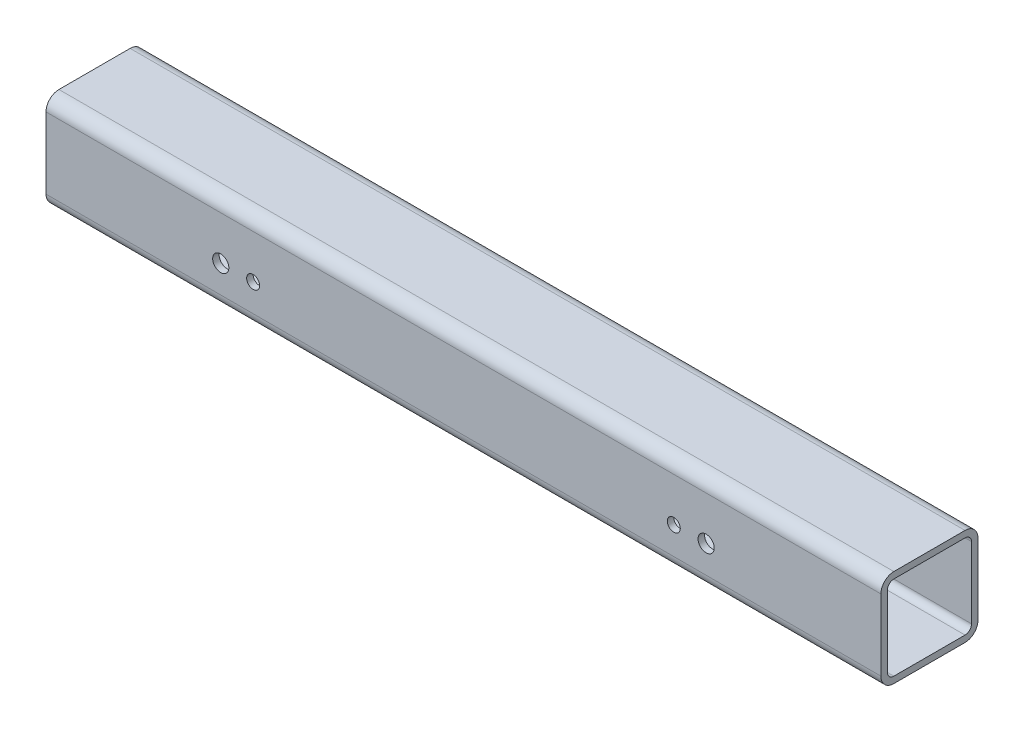
ISO-10303-21;
HEADER;
FILE_DESCRIPTION(('STEP AP214'),'2;1');
FILE_NAME('part.step','',(''),(''),'','','');
FILE_SCHEMA(('AUTOMOTIVE_DESIGN { 1 0 10303 214 1 1 1 1 }'));
ENDSEC;
DATA;
#1=APPLICATION_CONTEXT('core data for automotive mechanical design processes');
#2=APPLICATION_PROTOCOL_DEFINITION('international standard','automotive_design',2000,#1);
#3=PRODUCT_CONTEXT('',#1,'mechanical');
#4=PRODUCT('Part','Part','',(#3));
#5=PRODUCT_RELATED_PRODUCT_CATEGORY('part','',(#4));
#6=PRODUCT_DEFINITION_FORMATION('','',#4);
#7=PRODUCT_DEFINITION_CONTEXT('part definition',#1,'design');
#8=PRODUCT_DEFINITION('design','',#6,#7);
#9=PRODUCT_DEFINITION_SHAPE('','',#8);
#10=(LENGTH_UNIT() NAMED_UNIT(*) SI_UNIT(.MILLI.,.METRE.));
#11=(NAMED_UNIT(*) PLANE_ANGLE_UNIT() SI_UNIT($,.RADIAN.));
#12=(NAMED_UNIT(*) SI_UNIT($,.STERADIAN.) SOLID_ANGLE_UNIT());
#13=UNCERTAINTY_MEASURE_WITH_UNIT(LENGTH_MEASURE(1.E-05),#10,'distance_accuracy_value','');
#14=(GEOMETRIC_REPRESENTATION_CONTEXT(3) GLOBAL_UNCERTAINTY_ASSIGNED_CONTEXT((#13)) GLOBAL_UNIT_ASSIGNED_CONTEXT((#10,
#11,#12)) REPRESENTATION_CONTEXT('',''));
#15=CARTESIAN_POINT('',(0.,0.,0.));
#16=DIRECTION('',(0.,0.,1.));
#17=DIRECTION('',(1.,0.,0.));
#18=AXIS2_PLACEMENT_3D('',#15,#16,#17);
#19=CARTESIAN_POINT('',(129.,-11.,11.));
#20=DIRECTION('',(-1.,0.,0.));
#21=DIRECTION('',(0.,0.,1.));
#22=AXIS2_PLACEMENT_3D('',#19,#20,#21);
#23=PLANE('',#22);
#24=CARTESIAN_POINT('',(129.,-11.,11.));
#25=DIRECTION('',(1.,0.,0.));
#26=DIRECTION('',(0.,0.,1.));
#27=AXIS2_PLACEMENT_3D('',#24,#25,#26);
#28=CIRCLE('',#27,4.);
#29=CARTESIAN_POINT('',(129.,-11.,15.));
#30=VERTEX_POINT('',#29);
#31=CARTESIAN_POINT('',(129.,-15.,11.));
#32=VERTEX_POINT('',#31);
#33=EDGE_CURVE('E216',#30,#32,#28,.T.);
#34=ORIENTED_EDGE('',*,*,#33,.T.);
#35=DIRECTION('',(0.,0.,-1.));
#36=VECTOR('',#35,1.);
#37=CARTESIAN_POINT('',(129.,-15.,11.));
#38=LINE('',#37,#36);
#39=CARTESIAN_POINT('',(129.,-15.,-11.));
#40=VERTEX_POINT('',#39);
#41=EDGE_CURVE('E219',#32,#40,#38,.T.);
#42=ORIENTED_EDGE('',*,*,#41,.T.);
#43=CARTESIAN_POINT('',(129.,-11.,-11.));
#44=DIRECTION('',(1.,0.,0.));
#45=DIRECTION('',(0.,0.,-1.));
#46=AXIS2_PLACEMENT_3D('',#43,#44,#45);
#47=CIRCLE('',#46,4.);
#48=CARTESIAN_POINT('',(129.,-11.,-15.));
#49=VERTEX_POINT('',#48);
#50=EDGE_CURVE('E222',#40,#49,#47,.T.);
#51=ORIENTED_EDGE('',*,*,#50,.T.);
#52=DIRECTION('',(0.,1.,0.));
#53=VECTOR('',#52,1.);
#54=CARTESIAN_POINT('',(129.,-11.,-15.));
#55=LINE('',#54,#53);
#56=CARTESIAN_POINT('',(129.,11.,-15.));
#57=VERTEX_POINT('',#56);
#58=EDGE_CURVE('E224',#49,#57,#55,.T.);
#59=ORIENTED_EDGE('',*,*,#58,.T.);
#60=CARTESIAN_POINT('',(129.,11.,-11.));
#61=DIRECTION('',(1.,0.,0.));
#62=DIRECTION('',(0.,0.,1.));
#63=AXIS2_PLACEMENT_3D('',#60,#61,#62);
#64=CIRCLE('',#63,4.);
#65=CARTESIAN_POINT('',(129.,15.,-11.));
#66=VERTEX_POINT('',#65);
#67=EDGE_CURVE('E226',#57,#66,#64,.T.);
#68=ORIENTED_EDGE('',*,*,#67,.T.);
#69=DIRECTION('',(0.,0.,1.));
#70=VECTOR('',#69,1.);
#71=CARTESIAN_POINT('',(129.,15.,11.));
#72=LINE('',#71,#70);
#73=CARTESIAN_POINT('',(129.,15.,11.));
#74=VERTEX_POINT('',#73);
#75=EDGE_CURVE('E228',#66,#74,#72,.T.);
#76=ORIENTED_EDGE('',*,*,#75,.T.);
#77=CARTESIAN_POINT('',(129.,11.,11.));
#78=DIRECTION('',(1.,0.,0.));
#79=DIRECTION('',(0.,0.,1.));
#80=AXIS2_PLACEMENT_3D('',#77,#78,#79);
#81=CIRCLE('',#80,4.);
#82=CARTESIAN_POINT('',(129.,11.,15.));
#83=VERTEX_POINT('',#82);
#84=EDGE_CURVE('E230',#74,#83,#81,.T.);
#85=ORIENTED_EDGE('',*,*,#84,.T.);
#86=DIRECTION('',(0.,-1.,0.));
#87=VECTOR('',#86,1.);
#88=CARTESIAN_POINT('',(129.,-11.,15.));
#89=LINE('',#88,#87);
#90=EDGE_CURVE('E232',#83,#30,#89,.T.);
#91=ORIENTED_EDGE('',*,*,#90,.T.);
#92=EDGE_LOOP('',(#34,#42,#51,#59,#68,#76,#85,#91));
#93=FACE_BOUND('',#92,.T.);
#94=CARTESIAN_POINT('',(129.,-11.,11.));
#95=DIRECTION('',(1.,0.,0.));
#96=DIRECTION('',(0.,0.,1.));
#97=AXIS2_PLACEMENT_3D('',#94,#95,#96);
#98=CIRCLE('',#97,2.);
#99=CARTESIAN_POINT('',(129.,-11.,13.));
#100=VERTEX_POINT('',#99);
#101=CARTESIAN_POINT('',(129.,-13.,11.));
#102=VERTEX_POINT('',#101);
#103=EDGE_CURVE('E149',#100,#102,#98,.T.);
#104=ORIENTED_EDGE('',*,*,#103,.F.);
#105=DIRECTION('',(0.,-1.,0.));
#106=VECTOR('',#105,1.);
#107=CARTESIAN_POINT('',(129.,-11.,13.));
#108=LINE('',#107,#106);
#109=CARTESIAN_POINT('',(129.,11.,13.));
#110=VERTEX_POINT('',#109);
#111=EDGE_CURVE('E183',#110,#100,#108,.T.);
#112=ORIENTED_EDGE('',*,*,#111,.F.);
#113=CARTESIAN_POINT('',(129.,11.,11.));
#114=DIRECTION('',(1.,0.,0.));
#115=DIRECTION('',(0.,0.,1.));
#116=AXIS2_PLACEMENT_3D('',#113,#114,#115);
#117=CIRCLE('',#116,2.);
#118=CARTESIAN_POINT('',(129.,13.,11.));
#119=VERTEX_POINT('',#118);
#120=EDGE_CURVE('E181',#119,#110,#117,.T.);
#121=ORIENTED_EDGE('',*,*,#120,.F.);
#122=DIRECTION('',(0.,0.,1.));
#123=VECTOR('',#122,1.);
#124=CARTESIAN_POINT('',(129.,13.,11.));
#125=LINE('',#124,#123);
#126=CARTESIAN_POINT('',(129.,13.,-11.));
#127=VERTEX_POINT('',#126);
#128=EDGE_CURVE('E179',#127,#119,#125,.T.);
#129=ORIENTED_EDGE('',*,*,#128,.F.);
#130=CARTESIAN_POINT('',(129.,11.,-11.));
#131=DIRECTION('',(1.,0.,0.));
#132=DIRECTION('',(0.,0.,1.));
#133=AXIS2_PLACEMENT_3D('',#130,#131,#132);
#134=CIRCLE('',#133,2.);
#135=CARTESIAN_POINT('',(129.,11.,-13.));
#136=VERTEX_POINT('',#135);
#137=EDGE_CURVE('E177',#136,#127,#134,.T.);
#138=ORIENTED_EDGE('',*,*,#137,.F.);
#139=DIRECTION('',(0.,1.,0.));
#140=VECTOR('',#139,1.);
#141=CARTESIAN_POINT('',(129.,-11.,-13.));
#142=LINE('',#141,#140);
#143=CARTESIAN_POINT('',(129.,-11.,-13.));
#144=VERTEX_POINT('',#143);
#145=EDGE_CURVE('E172',#144,#136,#142,.T.);
#146=ORIENTED_EDGE('',*,*,#145,.F.);
#147=CARTESIAN_POINT('',(129.,-11.,-11.));
#148=DIRECTION('',(1.,0.,0.));
#149=DIRECTION('',(0.,0.,-1.));
#150=AXIS2_PLACEMENT_3D('',#147,#148,#149);
#151=CIRCLE('',#150,2.);
#152=CARTESIAN_POINT('',(129.,-13.,-11.));
#153=VERTEX_POINT('',#152);
#154=EDGE_CURVE('E170',#153,#144,#151,.T.);
#155=ORIENTED_EDGE('',*,*,#154,.F.);
#156=DIRECTION('',(0.,0.,-1.));
#157=VECTOR('',#156,1.);
#158=CARTESIAN_POINT('',(129.,-13.,11.));
#159=LINE('',#158,#157);
#160=EDGE_CURVE('E157',#102,#153,#159,.T.);
#161=ORIENTED_EDGE('',*,*,#160,.F.);
#162=EDGE_LOOP('',(#104,#112,#121,#129,#138,#146,#155,#161));
#163=FACE_BOUND('',#162,.T.);
#164=ADVANCED_FACE('F34',(#93,#163),#23,.F.);
#165=CARTESIAN_POINT('',(-129.,-11.,11.));
#166=DIRECTION('',(-1.,0.,0.));
#167=DIRECTION('',(0.,0.,1.));
#168=AXIS2_PLACEMENT_3D('',#165,#166,#167);
#169=PLANE('',#168);
#170=CARTESIAN_POINT('',(-129.,-11.,11.));
#171=DIRECTION('',(1.,0.,0.));
#172=DIRECTION('',(0.,0.,1.));
#173=AXIS2_PLACEMENT_3D('',#170,#171,#172);
#174=CIRCLE('',#173,4.);
#175=CARTESIAN_POINT('',(-129.,-11.,15.));
#176=VERTEX_POINT('',#175);
#177=CARTESIAN_POINT('',(-129.,-15.,11.));
#178=VERTEX_POINT('',#177);
#179=EDGE_CURVE('E165',#176,#178,#174,.T.);
#180=ORIENTED_EDGE('',*,*,#179,.F.);
#181=DIRECTION('',(0.,-1.,0.));
#182=VECTOR('',#181,1.);
#183=CARTESIAN_POINT('',(-129.,-11.,15.));
#184=LINE('',#183,#182);
#185=CARTESIAN_POINT('',(-129.,11.,15.));
#186=VERTEX_POINT('',#185);
#187=EDGE_CURVE('E220',#186,#176,#184,.T.);
#188=ORIENTED_EDGE('',*,*,#187,.F.);
#189=CARTESIAN_POINT('',(-129.,11.,11.));
#190=DIRECTION('',(1.,0.,0.));
#191=DIRECTION('',(0.,0.,1.));
#192=AXIS2_PLACEMENT_3D('',#189,#190,#191);
#193=CIRCLE('',#192,4.);
#194=CARTESIAN_POINT('',(-129.,15.,11.));
#195=VERTEX_POINT('',#194);
#196=EDGE_CURVE('E247',#195,#186,#193,.T.);
#197=ORIENTED_EDGE('',*,*,#196,.F.);
#198=DIRECTION('',(0.,0.,1.));
#199=VECTOR('',#198,1.);
#200=CARTESIAN_POINT('',(-129.,15.,11.));
#201=LINE('',#200,#199);
#202=CARTESIAN_POINT('',(-129.,15.,-11.));
#203=VERTEX_POINT('',#202);
#204=EDGE_CURVE('E245',#203,#195,#201,.T.);
#205=ORIENTED_EDGE('',*,*,#204,.F.);
#206=CARTESIAN_POINT('',(-129.,11.,-11.));
#207=DIRECTION('',(1.,0.,0.));
#208=DIRECTION('',(0.,0.,1.));
#209=AXIS2_PLACEMENT_3D('',#206,#207,#208);
#210=CIRCLE('',#209,4.);
#211=CARTESIAN_POINT('',(-129.,11.,-15.));
#212=VERTEX_POINT('',#211);
#213=EDGE_CURVE('E243',#212,#203,#210,.T.);
#214=ORIENTED_EDGE('',*,*,#213,.F.);
#215=DIRECTION('',(0.,1.,0.));
#216=VECTOR('',#215,1.);
#217=CARTESIAN_POINT('',(-129.,-11.,-15.));
#218=LINE('',#217,#216);
#219=CARTESIAN_POINT('',(-129.,-11.,-15.));
#220=VERTEX_POINT('',#219);
#221=EDGE_CURVE('E241',#220,#212,#218,.T.);
#222=ORIENTED_EDGE('',*,*,#221,.F.);
#223=CARTESIAN_POINT('',(-129.,-11.,-11.));
#224=DIRECTION('',(1.,0.,0.));
#225=DIRECTION('',(0.,0.,-1.));
#226=AXIS2_PLACEMENT_3D('',#223,#224,#225);
#227=CIRCLE('',#226,4.);
#228=CARTESIAN_POINT('',(-129.,-15.,-11.));
#229=VERTEX_POINT('',#228);
#230=EDGE_CURVE('E239',#229,#220,#227,.T.);
#231=ORIENTED_EDGE('',*,*,#230,.F.);
#232=DIRECTION('',(0.,0.,-1.));
#233=VECTOR('',#232,1.);
#234=CARTESIAN_POINT('',(-129.,-15.,11.));
#235=LINE('',#234,#233);
#236=EDGE_CURVE('E237',#178,#229,#235,.T.);
#237=ORIENTED_EDGE('',*,*,#236,.F.);
#238=EDGE_LOOP('',(#180,#188,#197,#205,#214,#222,#231,#237));
#239=FACE_BOUND('',#238,.T.);
#240=DIRECTION('',(0.,-1.,0.));
#241=VECTOR('',#240,1.);
#242=CARTESIAN_POINT('',(-129.,-11.,13.));
#243=LINE('',#242,#241);
#244=CARTESIAN_POINT('',(-129.,11.,13.));
#245=VERTEX_POINT('',#244);
#246=CARTESIAN_POINT('',(-129.,-11.,13.));
#247=VERTEX_POINT('',#246);
#248=EDGE_CURVE('E158',#245,#247,#243,.T.);
#249=ORIENTED_EDGE('',*,*,#248,.T.);
#250=CARTESIAN_POINT('',(-129.,-11.,11.));
#251=DIRECTION('',(1.,0.,0.));
#252=DIRECTION('',(0.,0.,1.));
#253=AXIS2_PLACEMENT_3D('',#250,#251,#252);
#254=CIRCLE('',#253,2.);
#255=CARTESIAN_POINT('',(-129.,-13.,11.));
#256=VERTEX_POINT('',#255);
#257=EDGE_CURVE('E59',#247,#256,#254,.T.);
#258=ORIENTED_EDGE('',*,*,#257,.T.);
#259=DIRECTION('',(0.,0.,-1.));
#260=VECTOR('',#259,1.);
#261=CARTESIAN_POINT('',(-129.,-13.,11.));
#262=LINE('',#261,#260);
#263=CARTESIAN_POINT('',(-129.,-13.,-11.));
#264=VERTEX_POINT('',#263);
#265=EDGE_CURVE('E164',#256,#264,#262,.T.);
#266=ORIENTED_EDGE('',*,*,#265,.T.);
#267=CARTESIAN_POINT('',(-129.,-11.,-11.));
#268=DIRECTION('',(1.,0.,0.));
#269=DIRECTION('',(0.,0.,-1.));
#270=AXIS2_PLACEMENT_3D('',#267,#268,#269);
#271=CIRCLE('',#270,2.);
#272=CARTESIAN_POINT('',(-129.,-11.,-13.));
#273=VERTEX_POINT('',#272);
#274=EDGE_CURVE('E188',#264,#273,#271,.T.);
#275=ORIENTED_EDGE('',*,*,#274,.T.);
#276=DIRECTION('',(0.,1.,0.));
#277=VECTOR('',#276,1.);
#278=CARTESIAN_POINT('',(-129.,-11.,-13.));
#279=LINE('',#278,#277);
#280=CARTESIAN_POINT('',(-129.,11.,-13.));
#281=VERTEX_POINT('',#280);
#282=EDGE_CURVE('E191',#273,#281,#279,.T.);
#283=ORIENTED_EDGE('',*,*,#282,.T.);
#284=CARTESIAN_POINT('',(-129.,11.,-11.));
#285=DIRECTION('',(1.,0.,0.));
#286=DIRECTION('',(0.,0.,1.));
#287=AXIS2_PLACEMENT_3D('',#284,#285,#286);
#288=CIRCLE('',#287,2.);
#289=CARTESIAN_POINT('',(-129.,13.,-11.));
#290=VERTEX_POINT('',#289);
#291=EDGE_CURVE('E194',#281,#290,#288,.T.);
#292=ORIENTED_EDGE('',*,*,#291,.T.);
#293=DIRECTION('',(0.,0.,1.));
#294=VECTOR('',#293,1.);
#295=CARTESIAN_POINT('',(-129.,13.,11.));
#296=LINE('',#295,#294);
#297=CARTESIAN_POINT('',(-129.,13.,11.));
#298=VERTEX_POINT('',#297);
#299=EDGE_CURVE('E197',#290,#298,#296,.T.);
#300=ORIENTED_EDGE('',*,*,#299,.T.);
#301=CARTESIAN_POINT('',(-129.,11.,11.));
#302=DIRECTION('',(1.,0.,0.));
#303=DIRECTION('',(0.,0.,1.));
#304=AXIS2_PLACEMENT_3D('',#301,#302,#303);
#305=CIRCLE('',#304,2.);
#306=EDGE_CURVE('E200',#298,#245,#305,.T.);
#307=ORIENTED_EDGE('',*,*,#306,.T.);
#308=EDGE_LOOP('',(#249,#258,#266,#275,#283,#292,#300,#307));
#309=FACE_BOUND('',#308,.T.);
#310=ADVANCED_FACE('F311',(#239,#309),#169,.T.);
#311=CARTESIAN_POINT('',(129.,-11.,11.));
#312=DIRECTION('',(-1.,0.,0.));
#313=DIRECTION('',(0.,0.,1.));
#314=AXIS2_PLACEMENT_3D('',#311,#312,#313);
#315=CYLINDRICAL_SURFACE('',#314,4.);
#316=ORIENTED_EDGE('',*,*,#179,.T.);
#317=DIRECTION('',(-1.,0.,0.));
#318=VECTOR('',#317,1.);
#319=CARTESIAN_POINT('',(129.,-15.,11.));
#320=LINE('',#319,#318);
#321=EDGE_CURVE('E11',#32,#178,#320,.T.);
#322=ORIENTED_EDGE('',*,*,#321,.F.);
#323=ORIENTED_EDGE('',*,*,#33,.F.);
#324=DIRECTION('',(-1.,0.,0.));
#325=VECTOR('',#324,1.);
#326=CARTESIAN_POINT('',(129.,-11.,15.));
#327=LINE('',#326,#325);
#328=EDGE_CURVE('E234',#30,#176,#327,.T.);
#329=ORIENTED_EDGE('',*,*,#328,.T.);
#330=EDGE_LOOP('',(#316,#322,#323,#329));
#331=FACE_BOUND('',#330,.T.);
#332=ADVANCED_FACE('F36',(#331),#315,.T.);
#333=CARTESIAN_POINT('',(129.,-15.,11.));
#334=DIRECTION('',(0.,1.,0.));
#335=DIRECTION('',(0.,0.,1.));
#336=AXIS2_PLACEMENT_3D('',#333,#334,#335);
#337=PLANE('',#336);
#338=ORIENTED_EDGE('',*,*,#236,.T.);
#339=DIRECTION('',(-1.,0.,0.));
#340=VECTOR('',#339,1.);
#341=CARTESIAN_POINT('',(129.,-15.,-11.));
#342=LINE('',#341,#340);
#343=EDGE_CURVE('E43',#40,#229,#342,.T.);
#344=ORIENTED_EDGE('',*,*,#343,.F.);
#345=ORIENTED_EDGE('',*,*,#41,.F.);
#346=ORIENTED_EDGE('',*,*,#321,.T.);
#347=EDGE_LOOP('',(#338,#344,#345,#346));
#348=FACE_BOUND('',#347,.T.);
#349=ADVANCED_FACE('F373',(#348),#337,.F.);
#350=CARTESIAN_POINT('',(129.,-11.,-11.));
#351=DIRECTION('',(-1.,0.,0.));
#352=DIRECTION('',(0.,0.,1.));
#353=AXIS2_PLACEMENT_3D('',#350,#351,#352);
#354=CYLINDRICAL_SURFACE('',#353,4.);
#355=ORIENTED_EDGE('',*,*,#230,.T.);
#356=DIRECTION('',(-1.,0.,0.));
#357=VECTOR('',#356,1.);
#358=CARTESIAN_POINT('',(129.,-11.,-15.));
#359=LINE('',#358,#357);
#360=EDGE_CURVE('E264',#49,#220,#359,.T.);
#361=ORIENTED_EDGE('',*,*,#360,.F.);
#362=ORIENTED_EDGE('',*,*,#50,.F.);
#363=ORIENTED_EDGE('',*,*,#343,.T.);
#364=EDGE_LOOP('',(#355,#361,#362,#363));
#365=FACE_BOUND('',#364,.T.);
#366=ADVANCED_FACE('F370',(#365),#354,.T.);
#367=CARTESIAN_POINT('',(129.,-11.,-15.));
#368=DIRECTION('',(0.,0.,1.));
#369=DIRECTION('',(0.,-1.,0.));
#370=AXIS2_PLACEMENT_3D('',#367,#368,#369);
#371=PLANE('',#370);
#372=CARTESIAN_POINT('',(-75.,-2.49999999999999,-15.));
#373=DIRECTION('',(0.,0.,1.));
#374=DIRECTION('',(1.,0.,0.));
#375=AXIS2_PLACEMENT_3D('',#372,#373,#374);
#376=CIRCLE('',#375,2.50000000000001);
#377=CARTESIAN_POINT('',(-72.5,-2.49999999999999,-15.));
#378=VERTEX_POINT('',#377);
#379=EDGE_CURVE('E273',#378,#378,#376,.T.);
#380=ORIENTED_EDGE('',*,*,#379,.T.);
#381=EDGE_LOOP('',(#380));
#382=FACE_BOUND('',#381,.T.);
#383=CARTESIAN_POINT('',(65.,-2.49999999999998,-15.));
#384=DIRECTION('',(0.,0.,1.));
#385=DIRECTION('',(-1.,0.,0.));
#386=AXIS2_PLACEMENT_3D('',#383,#384,#385);
#387=CIRCLE('',#386,2.);
#388=CARTESIAN_POINT('',(63.,-2.49999999999998,-15.));
#389=VERTEX_POINT('',#388);
#390=EDGE_CURVE('E588',#389,#389,#387,.T.);
#391=ORIENTED_EDGE('',*,*,#390,.T.);
#392=EDGE_LOOP('',(#391));
#393=FACE_BOUND('',#392,.T.);
#394=CARTESIAN_POINT('',(-65.,-2.49999999999999,-15.));
#395=DIRECTION('',(0.,0.,1.));
#396=DIRECTION('',(1.,0.,0.));
#397=AXIS2_PLACEMENT_3D('',#394,#395,#396);
#398=CIRCLE('',#397,2.);
#399=CARTESIAN_POINT('',(-63.,-2.49999999999999,-15.));
#400=VERTEX_POINT('',#399);
#401=EDGE_CURVE('E595',#400,#400,#398,.T.);
#402=ORIENTED_EDGE('',*,*,#401,.T.);
#403=EDGE_LOOP('',(#402));
#404=FACE_BOUND('',#403,.T.);
#405=CARTESIAN_POINT('',(75.,-2.49999999999997,-15.));
#406=DIRECTION('',(0.,0.,1.));
#407=DIRECTION('',(-1.,0.,0.));
#408=AXIS2_PLACEMENT_3D('',#405,#406,#407);
#409=CIRCLE('',#408,2.50000000000001);
#410=CARTESIAN_POINT('',(72.5,-2.49999999999997,-15.));
#411=VERTEX_POINT('',#410);
#412=EDGE_CURVE('E582',#411,#411,#409,.T.);
#413=ORIENTED_EDGE('',*,*,#412,.T.);
#414=EDGE_LOOP('',(#413));
#415=FACE_BOUND('',#414,.T.);
#416=ORIENTED_EDGE('',*,*,#221,.T.);
#417=DIRECTION('',(-1.,0.,0.));
#418=VECTOR('',#417,1.);
#419=CARTESIAN_POINT('',(129.,11.,-15.));
#420=LINE('',#419,#418);
#421=EDGE_CURVE('E261',#57,#212,#420,.T.);
#422=ORIENTED_EDGE('',*,*,#421,.F.);
#423=ORIENTED_EDGE('',*,*,#58,.F.);
#424=ORIENTED_EDGE('',*,*,#360,.T.);
#425=EDGE_LOOP('',(#416,#422,#423,#424));
#426=FACE_BOUND('',#425,.T.);
#427=ADVANCED_FACE('F366',(#382,#393,#404,#415,#426),#371,.F.);
#428=CARTESIAN_POINT('',(129.,11.,-11.));
#429=DIRECTION('',(-1.,0.,0.));
#430=DIRECTION('',(0.,0.,1.));
#431=AXIS2_PLACEMENT_3D('',#428,#429,#430);
#432=CYLINDRICAL_SURFACE('',#431,4.);
#433=ORIENTED_EDGE('',*,*,#213,.T.);
#434=DIRECTION('',(-1.,0.,0.));
#435=VECTOR('',#434,1.);
#436=CARTESIAN_POINT('',(129.,15.,-11.));
#437=LINE('',#436,#435);
#438=EDGE_CURVE('E258',#66,#203,#437,.T.);
#439=ORIENTED_EDGE('',*,*,#438,.F.);
#440=ORIENTED_EDGE('',*,*,#67,.F.);
#441=ORIENTED_EDGE('',*,*,#421,.T.);
#442=EDGE_LOOP('',(#433,#439,#440,#441));
#443=FACE_BOUND('',#442,.T.);
#444=ADVANCED_FACE('F362',(#443),#432,.T.);
#445=CARTESIAN_POINT('',(129.,15.,11.));
#446=DIRECTION('',(0.,-1.,0.));
#447=DIRECTION('',(0.,0.,-1.));
#448=AXIS2_PLACEMENT_3D('',#445,#446,#447);
#449=PLANE('',#448);
#450=ORIENTED_EDGE('',*,*,#204,.T.);
#451=DIRECTION('',(-1.,0.,0.));
#452=VECTOR('',#451,1.);
#453=CARTESIAN_POINT('',(129.,15.,11.));
#454=LINE('',#453,#452);
#455=EDGE_CURVE('E255',#74,#195,#454,.T.);
#456=ORIENTED_EDGE('',*,*,#455,.F.);
#457=ORIENTED_EDGE('',*,*,#75,.F.);
#458=ORIENTED_EDGE('',*,*,#438,.T.);
#459=EDGE_LOOP('',(#450,#456,#457,#458));
#460=FACE_BOUND('',#459,.T.);
#461=ADVANCED_FACE('F358',(#460),#449,.F.);
#462=CARTESIAN_POINT('',(129.,11.,11.));
#463=DIRECTION('',(-1.,0.,0.));
#464=DIRECTION('',(0.,0.,1.));
#465=AXIS2_PLACEMENT_3D('',#462,#463,#464);
#466=CYLINDRICAL_SURFACE('',#465,4.);
#467=ORIENTED_EDGE('',*,*,#196,.T.);
#468=DIRECTION('',(-1.,0.,0.));
#469=VECTOR('',#468,1.);
#470=CARTESIAN_POINT('',(129.,11.,15.));
#471=LINE('',#470,#469);
#472=EDGE_CURVE('E252',#83,#186,#471,.T.);
#473=ORIENTED_EDGE('',*,*,#472,.F.);
#474=ORIENTED_EDGE('',*,*,#84,.F.);
#475=ORIENTED_EDGE('',*,*,#455,.T.);
#476=EDGE_LOOP('',(#467,#473,#474,#475));
#477=FACE_BOUND('',#476,.T.);
#478=ADVANCED_FACE('F354',(#477),#466,.T.);
#479=CARTESIAN_POINT('',(129.,-11.,15.));
#480=DIRECTION('',(0.,0.,-1.));
#481=DIRECTION('',(-1.,0.,0.));
#482=AXIS2_PLACEMENT_3D('',#479,#480,#481);
#483=PLANE('',#482);
#484=CARTESIAN_POINT('',(-75.,-2.49999999999999,15.));
#485=DIRECTION('',(0.,0.,1.));
#486=DIRECTION('',(1.,0.,0.));
#487=AXIS2_PLACEMENT_3D('',#484,#485,#486);
#488=CIRCLE('',#487,2.50000000000001);
#489=CARTESIAN_POINT('',(-72.5,-2.49999999999999,15.));
#490=VERTEX_POINT('',#489);
#491=EDGE_CURVE('E579',#490,#490,#488,.T.);
#492=ORIENTED_EDGE('',*,*,#491,.F.);
#493=EDGE_LOOP('',(#492));
#494=FACE_BOUND('',#493,.T.);
#495=CARTESIAN_POINT('',(65.,-2.49999999999998,15.));
#496=DIRECTION('',(0.,0.,1.));
#497=DIRECTION('',(-1.,0.,0.));
#498=AXIS2_PLACEMENT_3D('',#495,#496,#497);
#499=CIRCLE('',#498,2.);
#500=CARTESIAN_POINT('',(63.,-2.49999999999998,15.));
#501=VERTEX_POINT('',#500);
#502=EDGE_CURVE('E585',#501,#501,#499,.T.);
#503=ORIENTED_EDGE('',*,*,#502,.F.);
#504=EDGE_LOOP('',(#503));
#505=FACE_BOUND('',#504,.T.);
#506=CARTESIAN_POINT('',(-65.,-2.49999999999999,15.));
#507=DIRECTION('',(0.,0.,1.));
#508=DIRECTION('',(1.,0.,0.));
#509=AXIS2_PLACEMENT_3D('',#506,#507,#508);
#510=CIRCLE('',#509,2.);
#511=CARTESIAN_POINT('',(-63.,-2.49999999999999,15.));
#512=VERTEX_POINT('',#511);
#513=EDGE_CURVE('E591',#512,#512,#510,.T.);
#514=ORIENTED_EDGE('',*,*,#513,.F.);
#515=EDGE_LOOP('',(#514));
#516=FACE_BOUND('',#515,.T.);
#517=CARTESIAN_POINT('',(75.,-2.49999999999997,15.));
#518=DIRECTION('',(0.,0.,1.));
#519=DIRECTION('',(-1.,0.,0.));
#520=AXIS2_PLACEMENT_3D('',#517,#518,#519);
#521=CIRCLE('',#520,2.50000000000001);
#522=CARTESIAN_POINT('',(72.5,-2.49999999999997,15.));
#523=VERTEX_POINT('',#522);
#524=EDGE_CURVE('E592',#523,#523,#521,.T.);
#525=ORIENTED_EDGE('',*,*,#524,.F.);
#526=EDGE_LOOP('',(#525));
#527=FACE_BOUND('',#526,.T.);
#528=ORIENTED_EDGE('',*,*,#187,.T.);
#529=ORIENTED_EDGE('',*,*,#328,.F.);
#530=ORIENTED_EDGE('',*,*,#90,.F.);
#531=ORIENTED_EDGE('',*,*,#472,.T.);
#532=EDGE_LOOP('',(#528,#529,#530,#531));
#533=FACE_BOUND('',#532,.T.);
#534=ADVANCED_FACE('F351',(#494,#505,#516,#527,#533),#483,.F.);
#535=CARTESIAN_POINT('',(129.,-11.,11.));
#536=DIRECTION('',(-1.,0.,0.));
#537=DIRECTION('',(0.,0.,1.));
#538=AXIS2_PLACEMENT_3D('',#535,#536,#537);
#539=CYLINDRICAL_SURFACE('',#538,2.);
#540=ORIENTED_EDGE('',*,*,#257,.F.);
#541=DIRECTION('',(-1.,0.,0.));
#542=VECTOR('',#541,1.);
#543=CARTESIAN_POINT('',(129.,-11.,13.));
#544=LINE('',#543,#542);
#545=EDGE_CURVE('E153',#100,#247,#544,.T.);
#546=ORIENTED_EDGE('',*,*,#545,.F.);
#547=ORIENTED_EDGE('',*,*,#103,.T.);
#548=DIRECTION('',(-1.,0.,0.));
#549=VECTOR('',#548,1.);
#550=CARTESIAN_POINT('',(129.,-13.,11.));
#551=LINE('',#550,#549);
#552=EDGE_CURVE('E152',#102,#256,#551,.T.);
#553=ORIENTED_EDGE('',*,*,#552,.T.);
#554=EDGE_LOOP('',(#540,#546,#547,#553));
#555=FACE_BOUND('',#554,.T.);
#556=ADVANCED_FACE('F151',(#555),#539,.F.);
#557=CARTESIAN_POINT('',(129.,-13.,11.));
#558=DIRECTION('',(0.,1.,0.));
#559=DIRECTION('',(0.,0.,1.));
#560=AXIS2_PLACEMENT_3D('',#557,#558,#559);
#561=PLANE('',#560);
#562=ORIENTED_EDGE('',*,*,#265,.F.);
#563=ORIENTED_EDGE('',*,*,#552,.F.);
#564=ORIENTED_EDGE('',*,*,#160,.T.);
#565=DIRECTION('',(-1.,0.,0.));
#566=VECTOR('',#565,1.);
#567=CARTESIAN_POINT('',(129.,-13.,-11.));
#568=LINE('',#567,#566);
#569=EDGE_CURVE('E166',#153,#264,#568,.T.);
#570=ORIENTED_EDGE('',*,*,#569,.T.);
#571=EDGE_LOOP('',(#562,#563,#564,#570));
#572=FACE_BOUND('',#571,.T.);
#573=ADVANCED_FACE('F161',(#572),#561,.T.);
#574=CARTESIAN_POINT('',(129.,-11.,-11.));
#575=DIRECTION('',(-1.,0.,0.));
#576=DIRECTION('',(0.,0.,1.));
#577=AXIS2_PLACEMENT_3D('',#574,#575,#576);
#578=CYLINDRICAL_SURFACE('',#577,2.);
#579=ORIENTED_EDGE('',*,*,#274,.F.);
#580=ORIENTED_EDGE('',*,*,#569,.F.);
#581=ORIENTED_EDGE('',*,*,#154,.T.);
#582=DIRECTION('',(-1.,0.,0.));
#583=VECTOR('',#582,1.);
#584=CARTESIAN_POINT('',(129.,-11.,-13.));
#585=LINE('',#584,#583);
#586=EDGE_CURVE('E213',#144,#273,#585,.T.);
#587=ORIENTED_EDGE('',*,*,#586,.T.);
#588=EDGE_LOOP('',(#579,#580,#581,#587));
#589=FACE_BOUND('',#588,.T.);
#590=ADVANCED_FACE('F331',(#589),#578,.F.);
#591=CARTESIAN_POINT('',(129.,-11.,-13.));
#592=DIRECTION('',(0.,0.,1.));
#593=DIRECTION('',(1.,0.,0.));
#594=AXIS2_PLACEMENT_3D('',#591,#592,#593);
#595=PLANE('',#594);
#596=CARTESIAN_POINT('',(-75.,-2.49999999999999,-13.));
#597=DIRECTION('',(0.,0.,1.));
#598=DIRECTION('',(1.,0.,0.));
#599=AXIS2_PLACEMENT_3D('',#596,#597,#598);
#600=CIRCLE('',#599,2.50000000000001);
#601=CARTESIAN_POINT('',(-72.5,-2.49999999999999,-13.));
#602=VERTEX_POINT('',#601);
#603=EDGE_CURVE('E186',#602,#602,#600,.T.);
#604=ORIENTED_EDGE('',*,*,#603,.F.);
#605=EDGE_LOOP('',(#604));
#606=FACE_BOUND('',#605,.T.);
#607=CARTESIAN_POINT('',(65.,-2.49999999999998,-13.));
#608=DIRECTION('',(0.,0.,1.));
#609=DIRECTION('',(1.,0.,0.));
#610=AXIS2_PLACEMENT_3D('',#607,#608,#609);
#611=CIRCLE('',#610,2.);
#612=CARTESIAN_POINT('',(67.,-2.49999999999998,-13.));
#613=VERTEX_POINT('',#612);
#614=EDGE_CURVE('E279',#613,#613,#611,.T.);
#615=ORIENTED_EDGE('',*,*,#614,.F.);
#616=EDGE_LOOP('',(#615));
#617=FACE_BOUND('',#616,.T.);
#618=CARTESIAN_POINT('',(-65.,-2.49999999999999,-13.));
#619=DIRECTION('',(0.,0.,1.));
#620=DIRECTION('',(1.,0.,0.));
#621=AXIS2_PLACEMENT_3D('',#618,#619,#620);
#622=CIRCLE('',#621,2.);
#623=CARTESIAN_POINT('',(-63.,-2.49999999999999,-13.));
#624=VERTEX_POINT('',#623);
#625=EDGE_CURVE('E276',#624,#624,#622,.T.);
#626=ORIENTED_EDGE('',*,*,#625,.F.);
#627=EDGE_LOOP('',(#626));
#628=FACE_BOUND('',#627,.T.);
#629=CARTESIAN_POINT('',(75.,-2.49999999999997,-13.));
#630=DIRECTION('',(0.,0.,1.));
#631=DIRECTION('',(1.,0.,0.));
#632=AXIS2_PLACEMENT_3D('',#629,#630,#631);
#633=CIRCLE('',#632,2.50000000000001);
#634=CARTESIAN_POINT('',(77.5,-2.49999999999997,-13.));
#635=VERTEX_POINT('',#634);
#636=EDGE_CURVE('E272',#635,#635,#633,.T.);
#637=ORIENTED_EDGE('',*,*,#636,.F.);
#638=EDGE_LOOP('',(#637));
#639=FACE_BOUND('',#638,.T.);
#640=ORIENTED_EDGE('',*,*,#282,.F.);
#641=ORIENTED_EDGE('',*,*,#586,.F.);
#642=ORIENTED_EDGE('',*,*,#145,.T.);
#643=DIRECTION('',(-1.,0.,0.));
#644=VECTOR('',#643,1.);
#645=CARTESIAN_POINT('',(129.,11.,-13.));
#646=LINE('',#645,#644);
#647=EDGE_CURVE('E211',#136,#281,#646,.T.);
#648=ORIENTED_EDGE('',*,*,#647,.T.);
#649=EDGE_LOOP('',(#640,#641,#642,#648));
#650=FACE_BOUND('',#649,.T.);
#651=ADVANCED_FACE('F327',(#606,#617,#628,#639,#650),#595,.T.);
#652=CARTESIAN_POINT('',(129.,11.,-11.));
#653=DIRECTION('',(-1.,0.,0.));
#654=DIRECTION('',(0.,0.,1.));
#655=AXIS2_PLACEMENT_3D('',#652,#653,#654);
#656=CYLINDRICAL_SURFACE('',#655,2.);
#657=ORIENTED_EDGE('',*,*,#291,.F.);
#658=ORIENTED_EDGE('',*,*,#647,.F.);
#659=ORIENTED_EDGE('',*,*,#137,.T.);
#660=DIRECTION('',(-1.,0.,0.));
#661=VECTOR('',#660,1.);
#662=CARTESIAN_POINT('',(129.,13.,-11.));
#663=LINE('',#662,#661);
#664=EDGE_CURVE('E209',#127,#290,#663,.T.);
#665=ORIENTED_EDGE('',*,*,#664,.T.);
#666=EDGE_LOOP('',(#657,#658,#659,#665));
#667=FACE_BOUND('',#666,.T.);
#668=ADVANCED_FACE('F323',(#667),#656,.F.);
#669=CARTESIAN_POINT('',(129.,13.,11.));
#670=DIRECTION('',(0.,-1.,0.));
#671=DIRECTION('',(0.,0.,-1.));
#672=AXIS2_PLACEMENT_3D('',#669,#670,#671);
#673=PLANE('',#672);
#674=ORIENTED_EDGE('',*,*,#299,.F.);
#675=ORIENTED_EDGE('',*,*,#664,.F.);
#676=ORIENTED_EDGE('',*,*,#128,.T.);
#677=DIRECTION('',(-1.,0.,0.));
#678=VECTOR('',#677,1.);
#679=CARTESIAN_POINT('',(129.,13.,11.));
#680=LINE('',#679,#678);
#681=EDGE_CURVE('E207',#119,#298,#680,.T.);
#682=ORIENTED_EDGE('',*,*,#681,.T.);
#683=EDGE_LOOP('',(#674,#675,#676,#682));
#684=FACE_BOUND('',#683,.T.);
#685=ADVANCED_FACE('F320',(#684),#673,.T.);
#686=CARTESIAN_POINT('',(129.,11.,11.));
#687=DIRECTION('',(-1.,0.,0.));
#688=DIRECTION('',(0.,0.,1.));
#689=AXIS2_PLACEMENT_3D('',#686,#687,#688);
#690=CYLINDRICAL_SURFACE('',#689,2.);
#691=ORIENTED_EDGE('',*,*,#306,.F.);
#692=ORIENTED_EDGE('',*,*,#681,.F.);
#693=ORIENTED_EDGE('',*,*,#120,.T.);
#694=DIRECTION('',(-1.,0.,0.));
#695=VECTOR('',#694,1.);
#696=CARTESIAN_POINT('',(129.,11.,13.));
#697=LINE('',#696,#695);
#698=EDGE_CURVE('E51',#110,#245,#697,.T.);
#699=ORIENTED_EDGE('',*,*,#698,.T.);
#700=EDGE_LOOP('',(#691,#692,#693,#699));
#701=FACE_BOUND('',#700,.T.);
#702=ADVANCED_FACE('F303',(#701),#690,.F.);
#703=CARTESIAN_POINT('',(129.,-11.,13.));
#704=DIRECTION('',(0.,0.,-1.));
#705=DIRECTION('',(0.,1.,0.));
#706=AXIS2_PLACEMENT_3D('',#703,#704,#705);
#707=PLANE('',#706);
#708=CARTESIAN_POINT('',(-75.,-2.49999999999999,13.));
#709=DIRECTION('',(0.,0.,-1.));
#710=DIRECTION('',(0.,1.,0.));
#711=AXIS2_PLACEMENT_3D('',#708,#709,#710);
#712=CIRCLE('',#711,2.50000000000001);
#713=CARTESIAN_POINT('',(-75.,0.,13.));
#714=VERTEX_POINT('',#713);
#715=EDGE_CURVE('E38',#714,#714,#712,.T.);
#716=ORIENTED_EDGE('',*,*,#715,.F.);
#717=EDGE_LOOP('',(#716));
#718=FACE_BOUND('',#717,.T.);
#719=CARTESIAN_POINT('',(65.,-2.49999999999998,13.));
#720=DIRECTION('',(0.,0.,-1.));
#721=DIRECTION('',(0.,1.,0.));
#722=AXIS2_PLACEMENT_3D('',#719,#720,#721);
#723=CIRCLE('',#722,2.);
#724=CARTESIAN_POINT('',(65.,-0.499999999999982,13.));
#725=VERTEX_POINT('',#724);
#726=EDGE_CURVE('E277',#725,#725,#723,.T.);
#727=ORIENTED_EDGE('',*,*,#726,.F.);
#728=EDGE_LOOP('',(#727));
#729=FACE_BOUND('',#728,.T.);
#730=CARTESIAN_POINT('',(-65.,-2.49999999999999,13.));
#731=DIRECTION('',(0.,0.,-1.));
#732=DIRECTION('',(0.,1.,0.));
#733=AXIS2_PLACEMENT_3D('',#730,#731,#732);
#734=CIRCLE('',#733,2.);
#735=CARTESIAN_POINT('',(-65.,-0.499999999999996,13.));
#736=VERTEX_POINT('',#735);
#737=EDGE_CURVE('E274',#736,#736,#734,.T.);
#738=ORIENTED_EDGE('',*,*,#737,.F.);
#739=EDGE_LOOP('',(#738));
#740=FACE_BOUND('',#739,.T.);
#741=CARTESIAN_POINT('',(75.,-2.49999999999997,13.));
#742=DIRECTION('',(0.,0.,-1.));
#743=DIRECTION('',(0.,1.,0.));
#744=AXIS2_PLACEMENT_3D('',#741,#742,#743);
#745=CIRCLE('',#744,2.50000000000001);
#746=CARTESIAN_POINT('',(75.,0.,13.));
#747=VERTEX_POINT('',#746);
#748=EDGE_CURVE('E269',#747,#747,#745,.T.);
#749=ORIENTED_EDGE('',*,*,#748,.F.);
#750=EDGE_LOOP('',(#749));
#751=FACE_BOUND('',#750,.T.);
#752=ORIENTED_EDGE('',*,*,#248,.F.);
#753=ORIENTED_EDGE('',*,*,#698,.F.);
#754=ORIENTED_EDGE('',*,*,#111,.T.);
#755=ORIENTED_EDGE('',*,*,#545,.T.);
#756=EDGE_LOOP('',(#752,#753,#754,#755));
#757=FACE_BOUND('',#756,.T.);
#758=ADVANCED_FACE('F299',(#718,#729,#740,#751,#757),#707,.T.);
#759=CARTESIAN_POINT('',(75.,-2.49999999999997,-15.));
#760=DIRECTION('',(0.,0.,1.));
#761=DIRECTION('',(1.,0.,0.));
#762=AXIS2_PLACEMENT_3D('',#759,#760,#761);
#763=CYLINDRICAL_SURFACE('',#762,2.50000000000001);
#764=ORIENTED_EDGE('',*,*,#748,.T.);
#765=EDGE_LOOP('',(#764));
#766=FACE_BOUND('',#765,.T.);
#767=ORIENTED_EDGE('',*,*,#524,.T.);
#768=EDGE_LOOP('',(#767));
#769=FACE_BOUND('',#768,.T.);
#770=ADVANCED_FACE('F302',(#766,#769),#763,.F.);
#771=CARTESIAN_POINT('',(-65.,-2.49999999999999,-15.));
#772=DIRECTION('',(0.,0.,1.));
#773=DIRECTION('',(1.,0.,0.));
#774=AXIS2_PLACEMENT_3D('',#771,#772,#773);
#775=CYLINDRICAL_SURFACE('',#774,2.);
#776=ORIENTED_EDGE('',*,*,#737,.T.);
#777=EDGE_LOOP('',(#776));
#778=FACE_BOUND('',#777,.T.);
#779=ORIENTED_EDGE('',*,*,#513,.T.);
#780=EDGE_LOOP('',(#779));
#781=FACE_BOUND('',#780,.T.);
#782=ADVANCED_FACE('F507',(#778,#781),#775,.F.);
#783=CARTESIAN_POINT('',(65.,-2.49999999999998,-15.));
#784=DIRECTION('',(0.,0.,1.));
#785=DIRECTION('',(1.,0.,0.));
#786=AXIS2_PLACEMENT_3D('',#783,#784,#785);
#787=CYLINDRICAL_SURFACE('',#786,2.);
#788=ORIENTED_EDGE('',*,*,#726,.T.);
#789=EDGE_LOOP('',(#788));
#790=FACE_BOUND('',#789,.T.);
#791=ORIENTED_EDGE('',*,*,#502,.T.);
#792=EDGE_LOOP('',(#791));
#793=FACE_BOUND('',#792,.T.);
#794=ADVANCED_FACE('F517',(#790,#793),#787,.F.);
#795=CARTESIAN_POINT('',(-75.,-2.49999999999999,-15.));
#796=DIRECTION('',(0.,0.,1.));
#797=DIRECTION('',(1.,0.,0.));
#798=AXIS2_PLACEMENT_3D('',#795,#796,#797);
#799=CYLINDRICAL_SURFACE('',#798,2.50000000000001);
#800=ORIENTED_EDGE('',*,*,#715,.T.);
#801=EDGE_LOOP('',(#800));
#802=FACE_BOUND('',#801,.T.);
#803=ORIENTED_EDGE('',*,*,#491,.T.);
#804=EDGE_LOOP('',(#803));
#805=FACE_BOUND('',#804,.T.);
#806=ADVANCED_FACE('F296',(#802,#805),#799,.F.);
#807=ORIENTED_EDGE('',*,*,#636,.T.);
#808=EDGE_LOOP('',(#807));
#809=FACE_BOUND('',#808,.T.);
#810=ORIENTED_EDGE('',*,*,#412,.F.);
#811=EDGE_LOOP('',(#810));
#812=FACE_BOUND('',#811,.T.);
#813=ADVANCED_FACE('F510',(#809,#812),#763,.F.);
#814=ORIENTED_EDGE('',*,*,#625,.T.);
#815=EDGE_LOOP('',(#814));
#816=FACE_BOUND('',#815,.T.);
#817=ORIENTED_EDGE('',*,*,#401,.F.);
#818=EDGE_LOOP('',(#817));
#819=FACE_BOUND('',#818,.T.);
#820=ADVANCED_FACE('F520',(#816,#819),#775,.F.);
#821=ORIENTED_EDGE('',*,*,#614,.T.);
#822=EDGE_LOOP('',(#821));
#823=FACE_BOUND('',#822,.T.);
#824=ORIENTED_EDGE('',*,*,#390,.F.);
#825=EDGE_LOOP('',(#824));
#826=FACE_BOUND('',#825,.T.);
#827=ADVANCED_FACE('F528',(#823,#826),#787,.F.);
#828=ORIENTED_EDGE('',*,*,#603,.T.);
#829=EDGE_LOOP('',(#828));
#830=FACE_BOUND('',#829,.T.);
#831=ORIENTED_EDGE('',*,*,#379,.F.);
#832=EDGE_LOOP('',(#831));
#833=FACE_BOUND('',#832,.T.);
#834=ADVANCED_FACE('F536',(#830,#833),#799,.F.);
#835=CLOSED_SHELL('',(#164,#310,#332,#349,#366,#427,#444,#461,#478,#534,#556,#573,#590,#651,
#668,#685,#702,#758,#770,#782,#794,#806,#813,#820,#827,#834));
#836=MANIFOLD_SOLID_BREP('B2',#835);
#837=ADVANCED_BREP_SHAPE_REPRESENTATION('',(#18,#836),#14);
#838=SHAPE_DEFINITION_REPRESENTATION(#9,#837);
ENDSEC;
END-ISO-10303-21;
